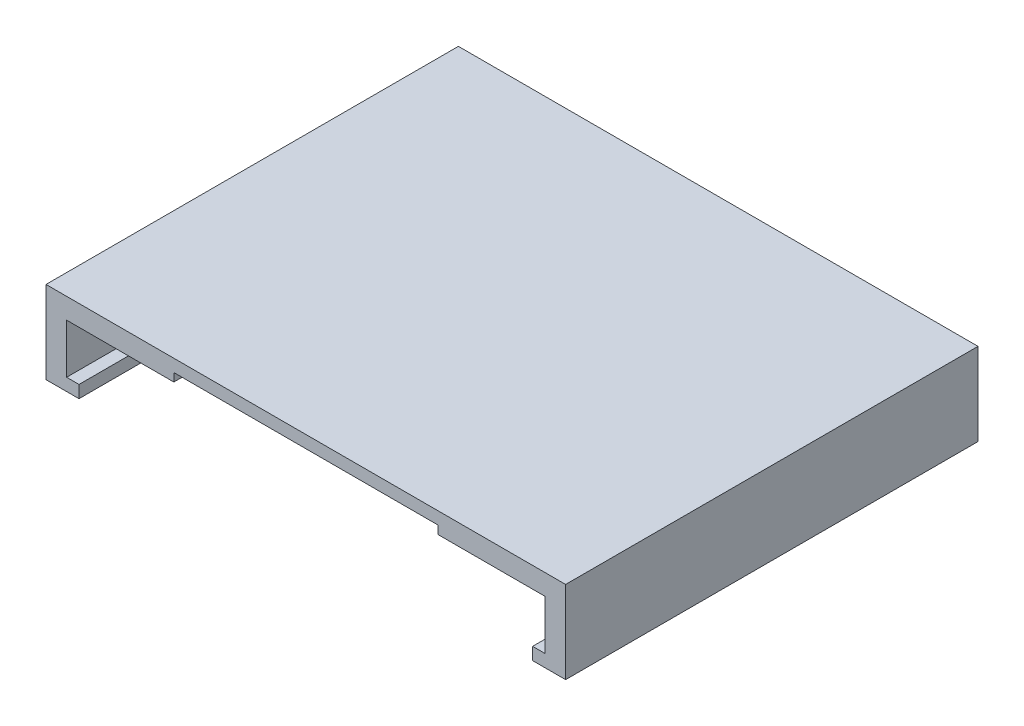
ISO-10303-21;
HEADER;
FILE_DESCRIPTION(('STEP AP214'),'2;1');
FILE_NAME('part.step','',(''),(''),'','','');
FILE_SCHEMA(('AUTOMOTIVE_DESIGN { 1 0 10303 214 1 1 1 1 }'));
ENDSEC;
DATA;
#1=APPLICATION_CONTEXT('core data for automotive mechanical design processes');
#2=APPLICATION_PROTOCOL_DEFINITION('international standard','automotive_design',2000,#1);
#3=PRODUCT_CONTEXT('',#1,'mechanical');
#4=PRODUCT('Part','Part','',(#3));
#5=PRODUCT_RELATED_PRODUCT_CATEGORY('part','',(#4));
#6=PRODUCT_DEFINITION_FORMATION('','',#4);
#7=PRODUCT_DEFINITION_CONTEXT('part definition',#1,'design');
#8=PRODUCT_DEFINITION('design','',#6,#7);
#9=PRODUCT_DEFINITION_SHAPE('','',#8);
#10=(LENGTH_UNIT() NAMED_UNIT(*) SI_UNIT(.MILLI.,.METRE.));
#11=(NAMED_UNIT(*) PLANE_ANGLE_UNIT() SI_UNIT($,.RADIAN.));
#12=(NAMED_UNIT(*) SI_UNIT($,.STERADIAN.) SOLID_ANGLE_UNIT());
#13=UNCERTAINTY_MEASURE_WITH_UNIT(LENGTH_MEASURE(1.E-05),#10,'distance_accuracy_value','');
#14=(GEOMETRIC_REPRESENTATION_CONTEXT(3) GLOBAL_UNCERTAINTY_ASSIGNED_CONTEXT((#13)) GLOBAL_UNIT_ASSIGNED_CONTEXT((#10,
#11,#12)) REPRESENTATION_CONTEXT('',''));
#15=CARTESIAN_POINT('',(0.,0.,0.));
#16=DIRECTION('',(0.,0.,1.));
#17=DIRECTION('',(1.,0.,0.));
#18=AXIS2_PLACEMENT_3D('',#15,#16,#17);
#19=CARTESIAN_POINT('',(0.,8.5,50.));
#20=DIRECTION('',(0.,1.,0.));
#21=DIRECTION('',(0.,0.,1.));
#22=AXIS2_PLACEMENT_3D('',#19,#20,#21);
#23=PLANE('',#22);
#24=DIRECTION('',(1.,0.,0.));
#25=VECTOR('',#24,1.);
#26=CARTESIAN_POINT('',(0.,8.5,0.));
#27=LINE('',#26,#25);
#28=CARTESIAN_POINT('',(15.5,8.5,0.));
#29=VERTEX_POINT('',#28);
#30=CARTESIAN_POINT('',(47.5,8.5,0.));
#31=VERTEX_POINT('',#30);
#32=EDGE_CURVE('E241',#29,#31,#27,.T.);
#33=ORIENTED_EDGE('',*,*,#32,.T.);
#34=DIRECTION('',(0.,0.,-1.));
#35=VECTOR('',#34,1.);
#36=CARTESIAN_POINT('',(47.5,8.5,50.));
#37=LINE('',#36,#35);
#38=CARTESIAN_POINT('',(47.5,8.5,50.));
#39=VERTEX_POINT('',#38);
#40=EDGE_CURVE('E11',#39,#31,#37,.T.);
#41=ORIENTED_EDGE('',*,*,#40,.F.);
#42=DIRECTION('',(1.,0.,0.));
#43=VECTOR('',#42,1.);
#44=CARTESIAN_POINT('',(0.,8.5,50.));
#45=LINE('',#44,#43);
#46=CARTESIAN_POINT('',(15.5,8.5,50.));
#47=VERTEX_POINT('',#46);
#48=EDGE_CURVE('E192',#47,#39,#45,.T.);
#49=ORIENTED_EDGE('',*,*,#48,.F.);
#50=DIRECTION('',(0.,0.,-1.));
#51=VECTOR('',#50,1.);
#52=CARTESIAN_POINT('',(15.5,8.5,50.));
#53=LINE('',#52,#51);
#54=EDGE_CURVE('E57',#47,#29,#53,.T.);
#55=ORIENTED_EDGE('',*,*,#54,.T.);
#56=EDGE_LOOP('',(#33,#41,#49,#55));
#57=FACE_BOUND('',#56,.T.);
#58=ADVANCED_FACE('F41',(#57),#23,.F.);
#59=CARTESIAN_POINT('',(47.5,0.,50.));
#60=DIRECTION('',(1.,0.,0.));
#61=DIRECTION('',(0.,0.,-1.));
#62=AXIS2_PLACEMENT_3D('',#59,#60,#61);
#63=PLANE('',#62);
#64=DIRECTION('',(0.,-1.,0.));
#65=VECTOR('',#64,1.);
#66=CARTESIAN_POINT('',(47.5,0.,0.));
#67=LINE('',#66,#65);
#68=CARTESIAN_POINT('',(47.5,7.50000000000001,0.));
#69=VERTEX_POINT('',#68);
#70=EDGE_CURVE('E235',#31,#69,#67,.T.);
#71=ORIENTED_EDGE('',*,*,#70,.T.);
#72=DIRECTION('',(0.,0.,-1.));
#73=VECTOR('',#72,1.);
#74=CARTESIAN_POINT('',(47.5,7.50000000000001,50.));
#75=LINE('',#74,#73);
#76=CARTESIAN_POINT('',(47.5,7.50000000000001,50.));
#77=VERTEX_POINT('',#76);
#78=EDGE_CURVE('E49',#77,#69,#75,.T.);
#79=ORIENTED_EDGE('',*,*,#78,.F.);
#80=DIRECTION('',(0.,-1.,0.));
#81=VECTOR('',#80,1.);
#82=CARTESIAN_POINT('',(47.5,0.,50.));
#83=LINE('',#82,#81);
#84=EDGE_CURVE('E120',#39,#77,#83,.T.);
#85=ORIENTED_EDGE('',*,*,#84,.F.);
#86=ORIENTED_EDGE('',*,*,#40,.T.);
#87=EDGE_LOOP('',(#71,#79,#85,#86));
#88=FACE_BOUND('',#87,.T.);
#89=ADVANCED_FACE('F338',(#88),#63,.F.);
#90=CARTESIAN_POINT('',(0.,7.5,50.));
#91=DIRECTION('',(0.,1.,0.));
#92=DIRECTION('',(-1.,0.,0.));
#93=AXIS2_PLACEMENT_3D('',#90,#91,#92);
#94=PLANE('',#93);
#95=DIRECTION('',(1.,0.,0.));
#96=VECTOR('',#95,1.);
#97=CARTESIAN_POINT('',(0.,7.5,0.));
#98=LINE('',#97,#96);
#99=CARTESIAN_POINT('',(60.5,7.50000000000001,0.));
#100=VERTEX_POINT('',#99);
#101=EDGE_CURVE('E201',#69,#100,#98,.T.);
#102=ORIENTED_EDGE('',*,*,#101,.T.);
#103=DIRECTION('',(0.,0.,-1.));
#104=VECTOR('',#103,1.);
#105=CARTESIAN_POINT('',(60.5,7.50000000000001,50.));
#106=LINE('',#105,#104);
#107=CARTESIAN_POINT('',(60.5,7.50000000000001,50.));
#108=VERTEX_POINT('',#107);
#109=EDGE_CURVE('E227',#108,#100,#106,.T.);
#110=ORIENTED_EDGE('',*,*,#109,.F.);
#111=DIRECTION('',(1.,0.,0.));
#112=VECTOR('',#111,1.);
#113=CARTESIAN_POINT('',(0.,7.5,50.));
#114=LINE('',#113,#112);
#115=EDGE_CURVE('E182',#77,#108,#114,.T.);
#116=ORIENTED_EDGE('',*,*,#115,.F.);
#117=ORIENTED_EDGE('',*,*,#78,.T.);
#118=EDGE_LOOP('',(#102,#110,#116,#117));
#119=FACE_BOUND('',#118,.T.);
#120=ADVANCED_FACE('F232',(#119),#94,.F.);
#121=CARTESIAN_POINT('',(60.5,0.,50.));
#122=DIRECTION('',(-1.,0.,0.));
#123=DIRECTION('',(0.,-1.,0.));
#124=AXIS2_PLACEMENT_3D('',#121,#122,#123);
#125=PLANE('',#124);
#126=DIRECTION('',(0.,1.,0.));
#127=VECTOR('',#126,1.);
#128=CARTESIAN_POINT('',(60.5,0.,0.));
#129=LINE('',#128,#127);
#130=CARTESIAN_POINT('',(60.5,1.5,0.));
#131=VERTEX_POINT('',#130);
#132=EDGE_CURVE('E238',#131,#100,#129,.T.);
#133=ORIENTED_EDGE('',*,*,#132,.F.);
#134=DIRECTION('',(0.,0.,-1.));
#135=VECTOR('',#134,1.);
#136=CARTESIAN_POINT('',(60.5,1.5,50.));
#137=LINE('',#136,#135);
#138=CARTESIAN_POINT('',(60.5,1.5,50.));
#139=VERTEX_POINT('',#138);
#140=EDGE_CURVE('E225',#139,#131,#137,.T.);
#141=ORIENTED_EDGE('',*,*,#140,.F.);
#142=DIRECTION('',(0.,1.,0.));
#143=VECTOR('',#142,1.);
#144=CARTESIAN_POINT('',(60.5,0.,50.));
#145=LINE('',#144,#143);
#146=EDGE_CURVE('E186',#139,#108,#145,.T.);
#147=ORIENTED_EDGE('',*,*,#146,.T.);
#148=ORIENTED_EDGE('',*,*,#109,.T.);
#149=EDGE_LOOP('',(#133,#141,#147,#148));
#150=FACE_BOUND('',#149,.T.);
#151=ADVANCED_FACE('F312',(#150),#125,.T.);
#152=CARTESIAN_POINT('',(0.,1.49999999999997,50.));
#153=DIRECTION('',(0.,-1.,0.));
#154=DIRECTION('',(1.,0.,0.));
#155=AXIS2_PLACEMENT_3D('',#152,#153,#154);
#156=PLANE('',#155);
#157=DIRECTION('',(-1.,0.,0.));
#158=VECTOR('',#157,1.);
#159=CARTESIAN_POINT('',(0.,1.49999999999997,0.));
#160=LINE('',#159,#158);
#161=CARTESIAN_POINT('',(59.,1.5,0.));
#162=VERTEX_POINT('',#161);
#163=EDGE_CURVE('E239',#131,#162,#160,.T.);
#164=ORIENTED_EDGE('',*,*,#163,.T.);
#165=DIRECTION('',(0.,0.,-1.));
#166=VECTOR('',#165,1.);
#167=CARTESIAN_POINT('',(59.,1.5,50.));
#168=LINE('',#167,#166);
#169=CARTESIAN_POINT('',(59.,1.5,50.));
#170=VERTEX_POINT('',#169);
#171=EDGE_CURVE('E223',#170,#162,#168,.T.);
#172=ORIENTED_EDGE('',*,*,#171,.F.);
#173=DIRECTION('',(-1.,0.,0.));
#174=VECTOR('',#173,1.);
#175=CARTESIAN_POINT('',(0.,1.49999999999997,50.));
#176=LINE('',#175,#174);
#177=EDGE_CURVE('E191',#139,#170,#176,.T.);
#178=ORIENTED_EDGE('',*,*,#177,.F.);
#179=ORIENTED_EDGE('',*,*,#140,.T.);
#180=EDGE_LOOP('',(#164,#172,#178,#179));
#181=FACE_BOUND('',#180,.T.);
#182=ADVANCED_FACE('F316',(#181),#156,.F.);
#183=CARTESIAN_POINT('',(59.,0.,50.));
#184=DIRECTION('',(-1.,0.,0.));
#185=DIRECTION('',(0.,0.,1.));
#186=AXIS2_PLACEMENT_3D('',#183,#184,#185);
#187=PLANE('',#186);
#188=DIRECTION('',(0.,1.,0.));
#189=VECTOR('',#188,1.);
#190=CARTESIAN_POINT('',(59.,0.,0.));
#191=LINE('',#190,#189);
#192=CARTESIAN_POINT('',(59.,0.,0.));
#193=VERTEX_POINT('',#192);
#194=EDGE_CURVE('E247',#193,#162,#191,.T.);
#195=ORIENTED_EDGE('',*,*,#194,.F.);
#196=DIRECTION('',(0.,0.,-1.));
#197=VECTOR('',#196,1.);
#198=CARTESIAN_POINT('',(59.,0.,50.));
#199=LINE('',#198,#197);
#200=CARTESIAN_POINT('',(59.,0.,50.));
#201=VERTEX_POINT('',#200);
#202=EDGE_CURVE('E221',#201,#193,#199,.T.);
#203=ORIENTED_EDGE('',*,*,#202,.F.);
#204=DIRECTION('',(0.,1.,0.));
#205=VECTOR('',#204,1.);
#206=CARTESIAN_POINT('',(59.,0.,50.));
#207=LINE('',#206,#205);
#208=EDGE_CURVE('E314',#201,#170,#207,.T.);
#209=ORIENTED_EDGE('',*,*,#208,.T.);
#210=ORIENTED_EDGE('',*,*,#171,.T.);
#211=EDGE_LOOP('',(#195,#203,#209,#210));
#212=FACE_BOUND('',#211,.T.);
#213=ADVANCED_FACE('F308',(#212),#187,.T.);
#214=CARTESIAN_POINT('',(0.,0.,50.));
#215=DIRECTION('',(0.,-1.,0.));
#216=DIRECTION('',(1.,0.,0.));
#217=AXIS2_PLACEMENT_3D('',#214,#215,#216);
#218=PLANE('',#217);
#219=DIRECTION('',(-1.,0.,0.));
#220=VECTOR('',#219,1.);
#221=CARTESIAN_POINT('',(0.,0.,0.));
#222=LINE('',#221,#220);
#223=CARTESIAN_POINT('',(63.,0.,0.));
#224=VERTEX_POINT('',#223);
#225=EDGE_CURVE('E250',#224,#193,#222,.T.);
#226=ORIENTED_EDGE('',*,*,#225,.F.);
#227=DIRECTION('',(0.,0.,-1.));
#228=VECTOR('',#227,1.);
#229=CARTESIAN_POINT('',(63.,0.,50.));
#230=LINE('',#229,#228);
#231=CARTESIAN_POINT('',(63.,0.,50.));
#232=VERTEX_POINT('',#231);
#233=EDGE_CURVE('E219',#232,#224,#230,.T.);
#234=ORIENTED_EDGE('',*,*,#233,.F.);
#235=DIRECTION('',(-1.,0.,0.));
#236=VECTOR('',#235,1.);
#237=CARTESIAN_POINT('',(0.,0.,50.));
#238=LINE('',#237,#236);
#239=EDGE_CURVE('E304',#232,#201,#238,.T.);
#240=ORIENTED_EDGE('',*,*,#239,.T.);
#241=ORIENTED_EDGE('',*,*,#202,.T.);
#242=EDGE_LOOP('',(#226,#234,#240,#241));
#243=FACE_BOUND('',#242,.T.);
#244=ADVANCED_FACE('F299',(#243),#218,.T.);
#245=CARTESIAN_POINT('',(63.,0.,50.));
#246=DIRECTION('',(-1.,0.,0.));
#247=DIRECTION('',(0.,0.,1.));
#248=AXIS2_PLACEMENT_3D('',#245,#246,#247);
#249=PLANE('',#248);
#250=DIRECTION('',(0.,1.,0.));
#251=VECTOR('',#250,1.);
#252=CARTESIAN_POINT('',(63.,0.,0.));
#253=LINE('',#252,#251);
#254=CARTESIAN_POINT('',(63.,10.,0.));
#255=VERTEX_POINT('',#254);
#256=EDGE_CURVE('E253',#224,#255,#253,.T.);
#257=ORIENTED_EDGE('',*,*,#256,.T.);
#258=DIRECTION('',(0.,0.,-1.));
#259=VECTOR('',#258,1.);
#260=CARTESIAN_POINT('',(63.,10.,50.));
#261=LINE('',#260,#259);
#262=CARTESIAN_POINT('',(63.,10.,50.));
#263=VERTEX_POINT('',#262);
#264=EDGE_CURVE('E217',#263,#255,#261,.T.);
#265=ORIENTED_EDGE('',*,*,#264,.F.);
#266=DIRECTION('',(0.,1.,0.));
#267=VECTOR('',#266,1.);
#268=CARTESIAN_POINT('',(63.,0.,50.));
#269=LINE('',#268,#267);
#270=EDGE_CURVE('E318',#232,#263,#269,.T.);
#271=ORIENTED_EDGE('',*,*,#270,.F.);
#272=ORIENTED_EDGE('',*,*,#233,.T.);
#273=EDGE_LOOP('',(#257,#265,#271,#272));
#274=FACE_BOUND('',#273,.T.);
#275=ADVANCED_FACE('F354',(#274),#249,.F.);
#276=CARTESIAN_POINT('',(0.,10.,50.));
#277=DIRECTION('',(0.,1.,0.));
#278=DIRECTION('',(-1.,0.,0.));
#279=AXIS2_PLACEMENT_3D('',#276,#277,#278);
#280=PLANE('',#279);
#281=DIRECTION('',(1.,0.,0.));
#282=VECTOR('',#281,1.);
#283=CARTESIAN_POINT('',(0.,10.,0.));
#284=LINE('',#283,#282);
#285=CARTESIAN_POINT('',(0.,10.,0.));
#286=VERTEX_POINT('',#285);
#287=EDGE_CURVE('E256',#286,#255,#284,.T.);
#288=ORIENTED_EDGE('',*,*,#287,.F.);
#289=DIRECTION('',(0.,0.,-1.));
#290=VECTOR('',#289,1.);
#291=CARTESIAN_POINT('',(0.,10.,50.));
#292=LINE('',#291,#290);
#293=CARTESIAN_POINT('',(0.,10.,50.));
#294=VERTEX_POINT('',#293);
#295=EDGE_CURVE('E215',#294,#286,#292,.T.);
#296=ORIENTED_EDGE('',*,*,#295,.F.);
#297=DIRECTION('',(1.,0.,0.));
#298=VECTOR('',#297,1.);
#299=CARTESIAN_POINT('',(0.,10.,50.));
#300=LINE('',#299,#298);
#301=EDGE_CURVE('E322',#294,#263,#300,.T.);
#302=ORIENTED_EDGE('',*,*,#301,.T.);
#303=ORIENTED_EDGE('',*,*,#264,.T.);
#304=EDGE_LOOP('',(#288,#296,#302,#303));
#305=FACE_BOUND('',#304,.T.);
#306=ADVANCED_FACE('F293',(#305),#280,.T.);
#307=CARTESIAN_POINT('',(0.,0.,50.));
#308=DIRECTION('',(-1.,0.,0.));
#309=DIRECTION('',(0.,0.,1.));
#310=AXIS2_PLACEMENT_3D('',#307,#308,#309);
#311=PLANE('',#310);
#312=DIRECTION('',(0.,1.,0.));
#313=VECTOR('',#312,1.);
#314=CARTESIAN_POINT('',(0.,0.,0.));
#315=LINE('',#314,#313);
#316=CARTESIAN_POINT('',(0.,0.,0.));
#317=VERTEX_POINT('',#316);
#318=EDGE_CURVE('E259',#317,#286,#315,.T.);
#319=ORIENTED_EDGE('',*,*,#318,.F.);
#320=DIRECTION('',(0.,0.,-1.));
#321=VECTOR('',#320,1.);
#322=CARTESIAN_POINT('',(0.,0.,50.));
#323=LINE('',#322,#321);
#324=CARTESIAN_POINT('',(0.,0.,50.));
#325=VERTEX_POINT('',#324);
#326=EDGE_CURVE('E213',#325,#317,#323,.T.);
#327=ORIENTED_EDGE('',*,*,#326,.F.);
#328=DIRECTION('',(0.,1.,0.));
#329=VECTOR('',#328,1.);
#330=CARTESIAN_POINT('',(0.,0.,50.));
#331=LINE('',#330,#329);
#332=EDGE_CURVE('E289',#325,#294,#331,.T.);
#333=ORIENTED_EDGE('',*,*,#332,.T.);
#334=ORIENTED_EDGE('',*,*,#295,.T.);
#335=EDGE_LOOP('',(#319,#327,#333,#334));
#336=FACE_BOUND('',#335,.T.);
#337=ADVANCED_FACE('F286',(#336),#311,.T.);
#338=CARTESIAN_POINT('',(0.,0.,50.));
#339=DIRECTION('',(0.,1.,0.));
#340=DIRECTION('',(-1.,0.,0.));
#341=AXIS2_PLACEMENT_3D('',#338,#339,#340);
#342=PLANE('',#341);
#343=DIRECTION('',(1.,0.,0.));
#344=VECTOR('',#343,1.);
#345=CARTESIAN_POINT('',(0.,0.,0.));
#346=LINE('',#345,#344);
#347=CARTESIAN_POINT('',(4.,0.,0.));
#348=VERTEX_POINT('',#347);
#349=EDGE_CURVE('E262',#317,#348,#346,.T.);
#350=ORIENTED_EDGE('',*,*,#349,.T.);
#351=DIRECTION('',(0.,0.,-1.));
#352=VECTOR('',#351,1.);
#353=CARTESIAN_POINT('',(4.,0.,50.));
#354=LINE('',#353,#352);
#355=CARTESIAN_POINT('',(4.,0.,50.));
#356=VERTEX_POINT('',#355);
#357=EDGE_CURVE('E210',#356,#348,#354,.T.);
#358=ORIENTED_EDGE('',*,*,#357,.F.);
#359=DIRECTION('',(1.,0.,0.));
#360=VECTOR('',#359,1.);
#361=CARTESIAN_POINT('',(0.,0.,50.));
#362=LINE('',#361,#360);
#363=EDGE_CURVE('E282',#325,#356,#362,.T.);
#364=ORIENTED_EDGE('',*,*,#363,.F.);
#365=ORIENTED_EDGE('',*,*,#326,.T.);
#366=EDGE_LOOP('',(#350,#358,#364,#365));
#367=FACE_BOUND('',#366,.T.);
#368=ADVANCED_FACE('F281',(#367),#342,.F.);
#369=CARTESIAN_POINT('',(4.,0.,50.));
#370=DIRECTION('',(-1.,0.,0.));
#371=DIRECTION('',(0.,0.,1.));
#372=AXIS2_PLACEMENT_3D('',#369,#370,#371);
#373=PLANE('',#372);
#374=DIRECTION('',(0.,1.,0.));
#375=VECTOR('',#374,1.);
#376=CARTESIAN_POINT('',(4.,0.,0.));
#377=LINE('',#376,#375);
#378=CARTESIAN_POINT('',(4.,1.5,0.));
#379=VERTEX_POINT('',#378);
#380=EDGE_CURVE('E264',#348,#379,#377,.T.);
#381=ORIENTED_EDGE('',*,*,#380,.T.);
#382=DIRECTION('',(0.,0.,-1.));
#383=VECTOR('',#382,1.);
#384=CARTESIAN_POINT('',(4.,1.5,50.));
#385=LINE('',#384,#383);
#386=CARTESIAN_POINT('',(4.,1.5,50.));
#387=VERTEX_POINT('',#386);
#388=EDGE_CURVE('E208',#387,#379,#385,.T.);
#389=ORIENTED_EDGE('',*,*,#388,.F.);
#390=DIRECTION('',(0.,1.,0.));
#391=VECTOR('',#390,1.);
#392=CARTESIAN_POINT('',(4.,0.,50.));
#393=LINE('',#392,#391);
#394=EDGE_CURVE('E278',#356,#387,#393,.T.);
#395=ORIENTED_EDGE('',*,*,#394,.F.);
#396=ORIENTED_EDGE('',*,*,#357,.T.);
#397=EDGE_LOOP('',(#381,#389,#395,#396));
#398=FACE_BOUND('',#397,.T.);
#399=ADVANCED_FACE('F276',(#398),#373,.F.);
#400=CARTESIAN_POINT('',(0.,1.5,50.));
#401=DIRECTION('',(0.,1.,0.));
#402=DIRECTION('',(0.,0.,1.));
#403=AXIS2_PLACEMENT_3D('',#400,#401,#402);
#404=PLANE('',#403);
#405=DIRECTION('',(1.,0.,0.));
#406=VECTOR('',#405,1.);
#407=CARTESIAN_POINT('',(0.,1.5,0.));
#408=LINE('',#407,#406);
#409=CARTESIAN_POINT('',(2.5,1.5,0.));
#410=VERTEX_POINT('',#409);
#411=EDGE_CURVE('E266',#410,#379,#408,.T.);
#412=ORIENTED_EDGE('',*,*,#411,.F.);
#413=DIRECTION('',(0.,0.,-1.));
#414=VECTOR('',#413,1.);
#415=CARTESIAN_POINT('',(2.5,1.5,50.));
#416=LINE('',#415,#414);
#417=CARTESIAN_POINT('',(2.5,1.5,50.));
#418=VERTEX_POINT('',#417);
#419=EDGE_CURVE('E177',#418,#410,#416,.T.);
#420=ORIENTED_EDGE('',*,*,#419,.F.);
#421=DIRECTION('',(1.,0.,0.));
#422=VECTOR('',#421,1.);
#423=CARTESIAN_POINT('',(0.,1.5,50.));
#424=LINE('',#423,#422);
#425=EDGE_CURVE('E167',#418,#387,#424,.T.);
#426=ORIENTED_EDGE('',*,*,#425,.T.);
#427=ORIENTED_EDGE('',*,*,#388,.T.);
#428=EDGE_LOOP('',(#412,#420,#426,#427));
#429=FACE_BOUND('',#428,.T.);
#430=ADVANCED_FACE('F272',(#429),#404,.T.);
#431=CARTESIAN_POINT('',(2.5,0.,50.));
#432=DIRECTION('',(-1.,0.,0.));
#433=DIRECTION('',(0.,0.,1.));
#434=AXIS2_PLACEMENT_3D('',#431,#432,#433);
#435=PLANE('',#434);
#436=DIRECTION('',(0.,1.,0.));
#437=VECTOR('',#436,1.);
#438=CARTESIAN_POINT('',(2.5,0.,0.));
#439=LINE('',#438,#437);
#440=CARTESIAN_POINT('',(2.5,7.5,0.));
#441=VERTEX_POINT('',#440);
#442=EDGE_CURVE('E174',#410,#441,#439,.T.);
#443=ORIENTED_EDGE('',*,*,#442,.T.);
#444=DIRECTION('',(0.,0.,-1.));
#445=VECTOR('',#444,1.);
#446=CARTESIAN_POINT('',(2.5,7.5,50.));
#447=LINE('',#446,#445);
#448=CARTESIAN_POINT('',(2.5,7.5,50.));
#449=VERTEX_POINT('',#448);
#450=EDGE_CURVE('E171',#449,#441,#447,.T.);
#451=ORIENTED_EDGE('',*,*,#450,.F.);
#452=DIRECTION('',(0.,1.,0.));
#453=VECTOR('',#452,1.);
#454=CARTESIAN_POINT('',(2.5,0.,50.));
#455=LINE('',#454,#453);
#456=EDGE_CURVE('E160',#418,#449,#455,.T.);
#457=ORIENTED_EDGE('',*,*,#456,.F.);
#458=ORIENTED_EDGE('',*,*,#419,.T.);
#459=EDGE_LOOP('',(#443,#451,#457,#458));
#460=FACE_BOUND('',#459,.T.);
#461=ADVANCED_FACE('F172',(#460),#435,.F.);
#462=CARTESIAN_POINT('',(15.5,7.5,0.));
#463=VERTEX_POINT('',#462);
#464=EDGE_CURVE('E197',#441,#463,#98,.T.);
#465=ORIENTED_EDGE('',*,*,#464,.T.);
#466=DIRECTION('',(0.,0.,-1.));
#467=VECTOR('',#466,1.);
#468=CARTESIAN_POINT('',(15.5,7.5,50.));
#469=LINE('',#468,#467);
#470=CARTESIAN_POINT('',(15.5,7.5,50.));
#471=VERTEX_POINT('',#470);
#472=EDGE_CURVE('E108',#471,#463,#469,.T.);
#473=ORIENTED_EDGE('',*,*,#472,.F.);
#474=EDGE_CURVE('E165',#449,#471,#114,.T.);
#475=ORIENTED_EDGE('',*,*,#474,.F.);
#476=ORIENTED_EDGE('',*,*,#450,.T.);
#477=EDGE_LOOP('',(#465,#473,#475,#476));
#478=FACE_BOUND('',#477,.T.);
#479=ADVANCED_FACE('F179',(#478),#94,.F.);
#480=CARTESIAN_POINT('',(15.5,0.,50.));
#481=DIRECTION('',(1.,0.,0.));
#482=DIRECTION('',(0.,0.,-1.));
#483=AXIS2_PLACEMENT_3D('',#480,#481,#482);
#484=PLANE('',#483);
#485=DIRECTION('',(0.,-1.,0.));
#486=VECTOR('',#485,1.);
#487=CARTESIAN_POINT('',(15.5,0.,0.));
#488=LINE('',#487,#486);
#489=EDGE_CURVE('E193',#29,#463,#488,.T.);
#490=ORIENTED_EDGE('',*,*,#489,.F.);
#491=ORIENTED_EDGE('',*,*,#54,.F.);
#492=DIRECTION('',(0.,-1.,0.));
#493=VECTOR('',#492,1.);
#494=CARTESIAN_POINT('',(15.5,0.,50.));
#495=LINE('',#494,#493);
#496=EDGE_CURVE('E180',#47,#471,#495,.T.);
#497=ORIENTED_EDGE('',*,*,#496,.T.);
#498=ORIENTED_EDGE('',*,*,#472,.T.);
#499=EDGE_LOOP('',(#490,#491,#497,#498));
#500=FACE_BOUND('',#499,.T.);
#501=ADVANCED_FACE('F327',(#500),#484,.T.);
#502=CARTESIAN_POINT('',(0.,0.,50.));
#503=DIRECTION('',(0.,0.,1.));
#504=DIRECTION('',(1.,0.,0.));
#505=AXIS2_PLACEMENT_3D('',#502,#503,#504);
#506=PLANE('',#505);
#507=ORIENTED_EDGE('',*,*,#48,.T.);
#508=ORIENTED_EDGE('',*,*,#84,.T.);
#509=ORIENTED_EDGE('',*,*,#115,.T.);
#510=ORIENTED_EDGE('',*,*,#146,.F.);
#511=ORIENTED_EDGE('',*,*,#177,.T.);
#512=ORIENTED_EDGE('',*,*,#208,.F.);
#513=ORIENTED_EDGE('',*,*,#239,.F.);
#514=ORIENTED_EDGE('',*,*,#270,.T.);
#515=ORIENTED_EDGE('',*,*,#301,.F.);
#516=ORIENTED_EDGE('',*,*,#332,.F.);
#517=ORIENTED_EDGE('',*,*,#363,.T.);
#518=ORIENTED_EDGE('',*,*,#394,.T.);
#519=ORIENTED_EDGE('',*,*,#425,.F.);
#520=ORIENTED_EDGE('',*,*,#456,.T.);
#521=ORIENTED_EDGE('',*,*,#474,.T.);
#522=ORIENTED_EDGE('',*,*,#496,.F.);
#523=EDGE_LOOP('',(#507,#508,#509,#510,#511,#512,#513,#514,#515,#516,#517,#518,#519,#520,#521,#522));
#524=FACE_BOUND('',#523,.T.);
#525=ADVANCED_FACE('F162',(#524),#506,.T.);
#526=CARTESIAN_POINT('',(0.,0.,0.));
#527=DIRECTION('',(0.,0.,1.));
#528=DIRECTION('',(1.,0.,0.));
#529=AXIS2_PLACEMENT_3D('',#526,#527,#528);
#530=PLANE('',#529);
#531=ORIENTED_EDGE('',*,*,#32,.F.);
#532=ORIENTED_EDGE('',*,*,#489,.T.);
#533=ORIENTED_EDGE('',*,*,#464,.F.);
#534=ORIENTED_EDGE('',*,*,#442,.F.);
#535=ORIENTED_EDGE('',*,*,#411,.T.);
#536=ORIENTED_EDGE('',*,*,#380,.F.);
#537=ORIENTED_EDGE('',*,*,#349,.F.);
#538=ORIENTED_EDGE('',*,*,#318,.T.);
#539=ORIENTED_EDGE('',*,*,#287,.T.);
#540=ORIENTED_EDGE('',*,*,#256,.F.);
#541=ORIENTED_EDGE('',*,*,#225,.T.);
#542=ORIENTED_EDGE('',*,*,#194,.T.);
#543=ORIENTED_EDGE('',*,*,#163,.F.);
#544=ORIENTED_EDGE('',*,*,#132,.T.);
#545=ORIENTED_EDGE('',*,*,#101,.F.);
#546=ORIENTED_EDGE('',*,*,#70,.F.);
#547=EDGE_LOOP('',(#531,#532,#533,#534,#535,#536,#537,#538,#539,#540,#541,#542,#543,#544,#545,#546));
#548=FACE_BOUND('',#547,.T.);
#549=ADVANCED_FACE('F234',(#548),#530,.F.);
#550=CLOSED_SHELL('',(#58,#89,#120,#151,#182,#213,#244,#275,#306,#337,#368,#399,#430,#461,#479,
#501,#525,#549));
#551=MANIFOLD_SOLID_BREP('B2',#550);
#552=ADVANCED_BREP_SHAPE_REPRESENTATION('',(#18,#551),#14);
#553=SHAPE_DEFINITION_REPRESENTATION(#9,#552);
ENDSEC;
END-ISO-10303-21;
